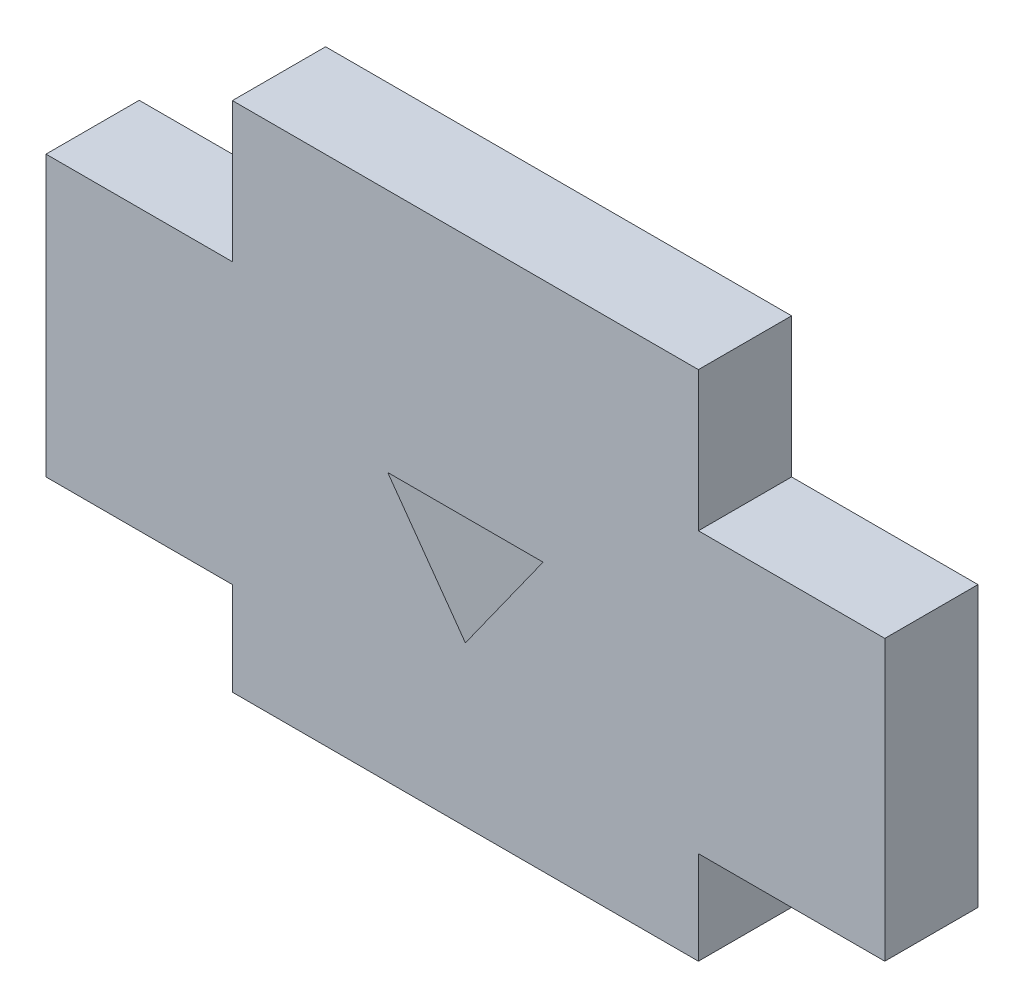
ISO-10303-21;
HEADER;
FILE_DESCRIPTION(('STEP AP214'),'2;1');
FILE_NAME('part.step','',(''),(''),'','','');
FILE_SCHEMA(('AUTOMOTIVE_DESIGN { 1 0 10303 214 1 1 1 1 }'));
ENDSEC;
DATA;
#1=APPLICATION_CONTEXT('core data for automotive mechanical design processes');
#2=APPLICATION_PROTOCOL_DEFINITION('international standard','automotive_design',2000,#1);
#3=PRODUCT_CONTEXT('',#1,'mechanical');
#4=PRODUCT('Part','Part','',(#3));
#5=PRODUCT_RELATED_PRODUCT_CATEGORY('part','',(#4));
#6=PRODUCT_DEFINITION_FORMATION('','',#4);
#7=PRODUCT_DEFINITION_CONTEXT('part definition',#1,'design');
#8=PRODUCT_DEFINITION('design','',#6,#7);
#9=PRODUCT_DEFINITION_SHAPE('','',#8);
#10=(LENGTH_UNIT() NAMED_UNIT(*) SI_UNIT(.MILLI.,.METRE.));
#11=(NAMED_UNIT(*) PLANE_ANGLE_UNIT() SI_UNIT($,.RADIAN.));
#12=(NAMED_UNIT(*) SI_UNIT($,.STERADIAN.) SOLID_ANGLE_UNIT());
#13=UNCERTAINTY_MEASURE_WITH_UNIT(LENGTH_MEASURE(1.E-05),#10,'distance_accuracy_value','');
#14=(GEOMETRIC_REPRESENTATION_CONTEXT(3) GLOBAL_UNCERTAINTY_ASSIGNED_CONTEXT((#13)) GLOBAL_UNIT_ASSIGNED_CONTEXT((#10,
#11,#12)) REPRESENTATION_CONTEXT('',''));
#15=CARTESIAN_POINT('',(0.,0.,0.));
#16=DIRECTION('',(0.,0.,1.));
#17=DIRECTION('',(1.,0.,0.));
#18=AXIS2_PLACEMENT_3D('',#15,#16,#17);
#19=CARTESIAN_POINT('',(0.,-35.3177567250291,6.));
#20=DIRECTION('',(0.,-1.,0.));
#21=DIRECTION('',(0.,0.,-1.));
#22=AXIS2_PLACEMENT_3D('',#19,#20,#21);
#23=PLANE('',#22);
#24=DIRECTION('',(-1.,0.,0.));
#25=VECTOR('',#24,1.);
#26=CARTESIAN_POINT('',(0.,-35.3177567250291,0.));
#27=LINE('',#26,#25);
#28=CARTESIAN_POINT('',(24.8661620551876,-35.3177567250291,0.));
#29=VERTEX_POINT('',#28);
#30=CARTESIAN_POINT('',(12.8661620551876,-35.3177567250291,0.));
#31=VERTEX_POINT('',#30);
#32=EDGE_CURVE('E203',#29,#31,#27,.T.);
#33=ORIENTED_EDGE('',*,*,#32,.T.);
#34=DIRECTION('',(0.,0.,-1.));
#35=VECTOR('',#34,1.);
#36=CARTESIAN_POINT('',(12.8661620551876,-35.3177567250291,6.));
#37=LINE('',#36,#35);
#38=CARTESIAN_POINT('',(12.8661620551876,-35.3177567250291,6.));
#39=VERTEX_POINT('',#38);
#40=EDGE_CURVE('E11',#39,#31,#37,.T.);
#41=ORIENTED_EDGE('',*,*,#40,.F.);
#42=DIRECTION('',(-1.,0.,0.));
#43=VECTOR('',#42,1.);
#44=CARTESIAN_POINT('',(0.,-35.3177567250291,6.));
#45=LINE('',#44,#43);
#46=CARTESIAN_POINT('',(24.8661620551876,-35.3177567250291,6.));
#47=VERTEX_POINT('',#46);
#48=EDGE_CURVE('E296',#47,#39,#45,.T.);
#49=ORIENTED_EDGE('',*,*,#48,.F.);
#50=DIRECTION('',(0.,0.,-1.));
#51=VECTOR('',#50,1.);
#52=CARTESIAN_POINT('',(24.8661620551876,-35.3177567250291,6.));
#53=LINE('',#52,#51);
#54=EDGE_CURVE('E61',#47,#29,#53,.T.);
#55=ORIENTED_EDGE('',*,*,#54,.T.);
#56=EDGE_LOOP('',(#33,#41,#49,#55));
#57=FACE_BOUND('',#56,.T.);
#58=ADVANCED_FACE('F41',(#57),#23,.F.);
#59=CARTESIAN_POINT('',(12.8661620551876,0.,6.));
#60=DIRECTION('',(-1.,0.,0.));
#61=DIRECTION('',(0.,0.,1.));
#62=AXIS2_PLACEMENT_3D('',#59,#60,#61);
#63=PLANE('',#62);
#64=DIRECTION('',(0.,1.,0.));
#65=VECTOR('',#64,1.);
#66=CARTESIAN_POINT('',(12.8661620551876,0.,0.));
#67=LINE('',#66,#65);
#68=CARTESIAN_POINT('',(12.8661620551876,-26.3328462460783,0.));
#69=VERTEX_POINT('',#68);
#70=EDGE_CURVE('E206',#31,#69,#67,.T.);
#71=ORIENTED_EDGE('',*,*,#70,.T.);
#72=DIRECTION('',(0.,0.,-1.));
#73=VECTOR('',#72,1.);
#74=CARTESIAN_POINT('',(12.8661620551876,-26.3328462460783,6.));
#75=LINE('',#74,#73);
#76=CARTESIAN_POINT('',(12.8661620551876,-26.3328462460783,6.));
#77=VERTEX_POINT('',#76);
#78=EDGE_CURVE('E52',#77,#69,#75,.T.);
#79=ORIENTED_EDGE('',*,*,#78,.F.);
#80=DIRECTION('',(0.,1.,0.));
#81=VECTOR('',#80,1.);
#82=CARTESIAN_POINT('',(12.8661620551876,0.,6.));
#83=LINE('',#82,#81);
#84=EDGE_CURVE('E300',#39,#77,#83,.T.);
#85=ORIENTED_EDGE('',*,*,#84,.F.);
#86=ORIENTED_EDGE('',*,*,#40,.T.);
#87=EDGE_LOOP('',(#71,#79,#85,#86));
#88=FACE_BOUND('',#87,.T.);
#89=ADVANCED_FACE('F352',(#88),#63,.F.);
#90=CARTESIAN_POINT('',(0.,-26.3328462460783,6.));
#91=DIRECTION('',(0.,1.,0.));
#92=DIRECTION('',(0.,0.,1.));
#93=AXIS2_PLACEMENT_3D('',#90,#91,#92);
#94=PLANE('',#93);
#95=DIRECTION('',(1.,0.,0.));
#96=VECTOR('',#95,1.);
#97=CARTESIAN_POINT('',(0.,-26.3328462460783,0.));
#98=LINE('',#97,#96);
#99=CARTESIAN_POINT('',(-17.1338379448124,-26.3328462460783,0.));
#100=VERTEX_POINT('',#99);
#101=EDGE_CURVE('E210',#100,#69,#98,.T.);
#102=ORIENTED_EDGE('',*,*,#101,.F.);
#103=DIRECTION('',(0.,0.,-1.));
#104=VECTOR('',#103,1.);
#105=CARTESIAN_POINT('',(-17.1338379448124,-26.3328462460783,6.));
#106=LINE('',#105,#104);
#107=CARTESIAN_POINT('',(-17.1338379448124,-26.3328462460783,6.));
#108=VERTEX_POINT('',#107);
#109=EDGE_CURVE('E268',#108,#100,#106,.T.);
#110=ORIENTED_EDGE('',*,*,#109,.F.);
#111=DIRECTION('',(1.,0.,0.));
#112=VECTOR('',#111,1.);
#113=CARTESIAN_POINT('',(0.,-26.3328462460783,6.));
#114=LINE('',#113,#112);
#115=EDGE_CURVE('E306',#108,#77,#114,.T.);
#116=ORIENTED_EDGE('',*,*,#115,.T.);
#117=ORIENTED_EDGE('',*,*,#78,.T.);
#118=EDGE_LOOP('',(#102,#110,#116,#117));
#119=FACE_BOUND('',#118,.T.);
#120=ADVANCED_FACE('F357',(#119),#94,.T.);
#121=CARTESIAN_POINT('',(-17.1338379448124,0.,6.));
#122=DIRECTION('',(-1.,0.,0.));
#123=DIRECTION('',(0.,-1.,0.));
#124=AXIS2_PLACEMENT_3D('',#121,#122,#123);
#125=PLANE('',#124);
#126=DIRECTION('',(0.,1.,0.));
#127=VECTOR('',#126,1.);
#128=CARTESIAN_POINT('',(-17.1338379448124,0.,0.));
#129=LINE('',#128,#127);
#130=CARTESIAN_POINT('',(-17.1338379448124,-35.3177567250291,0.));
#131=VERTEX_POINT('',#130);
#132=EDGE_CURVE('E214',#131,#100,#129,.T.);
#133=ORIENTED_EDGE('',*,*,#132,.F.);
#134=DIRECTION('',(0.,0.,-1.));
#135=VECTOR('',#134,1.);
#136=CARTESIAN_POINT('',(-17.1338379448124,-35.3177567250291,6.));
#137=LINE('',#136,#135);
#138=CARTESIAN_POINT('',(-17.1338379448124,-35.3177567250291,6.));
#139=VERTEX_POINT('',#138);
#140=EDGE_CURVE('E265',#139,#131,#137,.T.);
#141=ORIENTED_EDGE('',*,*,#140,.F.);
#142=DIRECTION('',(0.,1.,0.));
#143=VECTOR('',#142,1.);
#144=CARTESIAN_POINT('',(-17.1338379448124,0.,6.));
#145=LINE('',#144,#143);
#146=EDGE_CURVE('E310',#139,#108,#145,.T.);
#147=ORIENTED_EDGE('',*,*,#146,.T.);
#148=ORIENTED_EDGE('',*,*,#109,.T.);
#149=EDGE_LOOP('',(#133,#141,#147,#148));
#150=FACE_BOUND('',#149,.T.);
#151=ADVANCED_FACE('F452',(#150),#125,.T.);
#152=CARTESIAN_POINT('',(0.,-35.3177567250291,6.));
#153=DIRECTION('',(0.,1.,0.));
#154=DIRECTION('',(0.,0.,1.));
#155=AXIS2_PLACEMENT_3D('',#152,#153,#154);
#156=PLANE('',#155);
#157=DIRECTION('',(1.,0.,0.));
#158=VECTOR('',#157,1.);
#159=CARTESIAN_POINT('',(0.,-35.3177567250291,0.));
#160=LINE('',#159,#158);
#161=CARTESIAN_POINT('',(-29.1338379448124,-35.3177567250291,0.));
#162=VERTEX_POINT('',#161);
#163=EDGE_CURVE('E218',#162,#131,#160,.T.);
#164=ORIENTED_EDGE('',*,*,#163,.F.);
#165=DIRECTION('',(0.,0.,-1.));
#166=VECTOR('',#165,1.);
#167=CARTESIAN_POINT('',(-29.1338379448124,-35.3177567250291,6.));
#168=LINE('',#167,#166);
#169=CARTESIAN_POINT('',(-29.1338379448124,-35.3177567250291,6.));
#170=VERTEX_POINT('',#169);
#171=EDGE_CURVE('E262',#170,#162,#168,.T.);
#172=ORIENTED_EDGE('',*,*,#171,.F.);
#173=DIRECTION('',(1.,0.,0.));
#174=VECTOR('',#173,1.);
#175=CARTESIAN_POINT('',(0.,-35.3177567250291,6.));
#176=LINE('',#175,#174);
#177=EDGE_CURVE('E314',#170,#139,#176,.T.);
#178=ORIENTED_EDGE('',*,*,#177,.T.);
#179=ORIENTED_EDGE('',*,*,#140,.T.);
#180=EDGE_LOOP('',(#164,#172,#178,#179));
#181=FACE_BOUND('',#180,.T.);
#182=ADVANCED_FACE('F443',(#181),#156,.T.);
#183=CARTESIAN_POINT('',(-29.1338379448124,0.,6.));
#184=DIRECTION('',(1.,0.,0.));
#185=DIRECTION('',(0.,0.,-1.));
#186=AXIS2_PLACEMENT_3D('',#183,#184,#185);
#187=PLANE('',#186);
#188=DIRECTION('',(0.,-1.,0.));
#189=VECTOR('',#188,1.);
#190=CARTESIAN_POINT('',(-29.1338379448124,0.,0.));
#191=LINE('',#190,#189);
#192=CARTESIAN_POINT('',(-29.1338379448124,-53.3177567250291,0.));
#193=VERTEX_POINT('',#192);
#194=EDGE_CURVE('E222',#162,#193,#191,.T.);
#195=ORIENTED_EDGE('',*,*,#194,.T.);
#196=DIRECTION('',(0.,0.,-1.));
#197=VECTOR('',#196,1.);
#198=CARTESIAN_POINT('',(-29.1338379448124,-53.3177567250291,6.));
#199=LINE('',#198,#197);
#200=CARTESIAN_POINT('',(-29.1338379448124,-53.3177567250291,6.));
#201=VERTEX_POINT('',#200);
#202=EDGE_CURVE('E258',#201,#193,#199,.T.);
#203=ORIENTED_EDGE('',*,*,#202,.F.);
#204=DIRECTION('',(0.,-1.,0.));
#205=VECTOR('',#204,1.);
#206=CARTESIAN_POINT('',(-29.1338379448124,0.,6.));
#207=LINE('',#206,#205);
#208=EDGE_CURVE('E318',#170,#201,#207,.T.);
#209=ORIENTED_EDGE('',*,*,#208,.F.);
#210=ORIENTED_EDGE('',*,*,#171,.T.);
#211=EDGE_LOOP('',(#195,#203,#209,#210));
#212=FACE_BOUND('',#211,.T.);
#213=ADVANCED_FACE('F435',(#212),#187,.F.);
#214=CARTESIAN_POINT('',(0.,-53.3177567250291,6.));
#215=DIRECTION('',(0.,1.,0.));
#216=DIRECTION('',(0.,0.,1.));
#217=AXIS2_PLACEMENT_3D('',#214,#215,#216);
#218=PLANE('',#217);
#219=DIRECTION('',(1.,0.,0.));
#220=VECTOR('',#219,1.);
#221=CARTESIAN_POINT('',(0.,-53.3177567250291,0.));
#222=LINE('',#221,#220);
#223=CARTESIAN_POINT('',(-17.1338379448124,-53.3177567250291,0.));
#224=VERTEX_POINT('',#223);
#225=EDGE_CURVE('E225',#193,#224,#222,.T.);
#226=ORIENTED_EDGE('',*,*,#225,.T.);
#227=DIRECTION('',(0.,0.,-1.));
#228=VECTOR('',#227,1.);
#229=CARTESIAN_POINT('',(-17.1338379448124,-53.3177567250291,6.));
#230=LINE('',#229,#228);
#231=CARTESIAN_POINT('',(-17.1338379448124,-53.3177567250291,6.));
#232=VERTEX_POINT('',#231);
#233=EDGE_CURVE('E255',#232,#224,#230,.T.);
#234=ORIENTED_EDGE('',*,*,#233,.F.);
#235=DIRECTION('',(1.,0.,0.));
#236=VECTOR('',#235,1.);
#237=CARTESIAN_POINT('',(0.,-53.3177567250291,6.));
#238=LINE('',#237,#236);
#239=EDGE_CURVE('E321',#201,#232,#238,.T.);
#240=ORIENTED_EDGE('',*,*,#239,.F.);
#241=ORIENTED_EDGE('',*,*,#202,.T.);
#242=EDGE_LOOP('',(#226,#234,#240,#241));
#243=FACE_BOUND('',#242,.T.);
#244=ADVANCED_FACE('F337',(#243),#218,.F.);
#245=CARTESIAN_POINT('',(-17.1338379448124,0.,6.));
#246=DIRECTION('',(-1.,0.,0.));
#247=DIRECTION('',(0.,0.,1.));
#248=AXIS2_PLACEMENT_3D('',#245,#246,#247);
#249=PLANE('',#248);
#250=DIRECTION('',(0.,1.,0.));
#251=VECTOR('',#250,1.);
#252=CARTESIAN_POINT('',(-17.1338379448124,0.,0.));
#253=LINE('',#252,#251);
#254=CARTESIAN_POINT('',(-17.1338379448124,-59.3177567250291,0.));
#255=VERTEX_POINT('',#254);
#256=EDGE_CURVE('E229',#255,#224,#253,.T.);
#257=ORIENTED_EDGE('',*,*,#256,.F.);
#258=DIRECTION('',(0.,0.,-1.));
#259=VECTOR('',#258,1.);
#260=CARTESIAN_POINT('',(-17.1338379448124,-59.3177567250291,6.));
#261=LINE('',#260,#259);
#262=CARTESIAN_POINT('',(-17.1338379448124,-59.3177567250291,6.));
#263=VERTEX_POINT('',#262);
#264=EDGE_CURVE('E252',#263,#255,#261,.T.);
#265=ORIENTED_EDGE('',*,*,#264,.F.);
#266=DIRECTION('',(0.,1.,0.));
#267=VECTOR('',#266,1.);
#268=CARTESIAN_POINT('',(-17.1338379448124,0.,6.));
#269=LINE('',#268,#267);
#270=EDGE_CURVE('E324',#263,#232,#269,.T.);
#271=ORIENTED_EDGE('',*,*,#270,.T.);
#272=ORIENTED_EDGE('',*,*,#233,.T.);
#273=EDGE_LOOP('',(#257,#265,#271,#272));
#274=FACE_BOUND('',#273,.T.);
#275=ADVANCED_FACE('F330',(#274),#249,.T.);
#276=CARTESIAN_POINT('',(0.,-59.3177567250291,6.));
#277=DIRECTION('',(0.,1.,0.));
#278=DIRECTION('',(0.,0.,1.));
#279=AXIS2_PLACEMENT_3D('',#276,#277,#278);
#280=PLANE('',#279);
#281=DIRECTION('',(1.,0.,0.));
#282=VECTOR('',#281,1.);
#283=CARTESIAN_POINT('',(0.,-59.3177567250291,0.));
#284=LINE('',#283,#282);
#285=CARTESIAN_POINT('',(12.8661620551876,-59.3177567250291,0.));
#286=VERTEX_POINT('',#285);
#287=EDGE_CURVE('E233',#255,#286,#284,.T.);
#288=ORIENTED_EDGE('',*,*,#287,.T.);
#289=DIRECTION('',(0.,0.,-1.));
#290=VECTOR('',#289,1.);
#291=CARTESIAN_POINT('',(12.8661620551876,-59.3177567250291,6.));
#292=LINE('',#291,#290);
#293=CARTESIAN_POINT('',(12.8661620551876,-59.3177567250291,6.));
#294=VERTEX_POINT('',#293);
#295=EDGE_CURVE('E180',#294,#286,#292,.T.);
#296=ORIENTED_EDGE('',*,*,#295,.F.);
#297=DIRECTION('',(1.,0.,0.));
#298=VECTOR('',#297,1.);
#299=CARTESIAN_POINT('',(0.,-59.3177567250291,6.));
#300=LINE('',#299,#298);
#301=EDGE_CURVE('E166',#263,#294,#300,.T.);
#302=ORIENTED_EDGE('',*,*,#301,.F.);
#303=ORIENTED_EDGE('',*,*,#264,.T.);
#304=EDGE_LOOP('',(#288,#296,#302,#303));
#305=FACE_BOUND('',#304,.T.);
#306=ADVANCED_FACE('F342',(#305),#280,.F.);
#307=CARTESIAN_POINT('',(12.8661620551876,0.,6.));
#308=DIRECTION('',(-1.,0.,0.));
#309=DIRECTION('',(0.,0.,1.));
#310=AXIS2_PLACEMENT_3D('',#307,#308,#309);
#311=PLANE('',#310);
#312=DIRECTION('',(0.,1.,0.));
#313=VECTOR('',#312,1.);
#314=CARTESIAN_POINT('',(12.8661620551876,0.,0.));
#315=LINE('',#314,#313);
#316=CARTESIAN_POINT('',(12.8661620551876,-53.3177567250291,0.));
#317=VERTEX_POINT('',#316);
#318=EDGE_CURVE('E176',#286,#317,#315,.T.);
#319=ORIENTED_EDGE('',*,*,#318,.T.);
#320=DIRECTION('',(0.,0.,-1.));
#321=VECTOR('',#320,1.);
#322=CARTESIAN_POINT('',(12.8661620551876,-53.3177567250291,6.));
#323=LINE('',#322,#321);
#324=CARTESIAN_POINT('',(12.8661620551876,-53.3177567250291,6.));
#325=VERTEX_POINT('',#324);
#326=EDGE_CURVE('E173',#325,#317,#323,.T.);
#327=ORIENTED_EDGE('',*,*,#326,.F.);
#328=DIRECTION('',(0.,1.,0.));
#329=VECTOR('',#328,1.);
#330=CARTESIAN_POINT('',(12.8661620551876,0.,6.));
#331=LINE('',#330,#329);
#332=EDGE_CURVE('E157',#294,#325,#331,.T.);
#333=ORIENTED_EDGE('',*,*,#332,.F.);
#334=ORIENTED_EDGE('',*,*,#295,.T.);
#335=EDGE_LOOP('',(#319,#327,#333,#334));
#336=FACE_BOUND('',#335,.T.);
#337=ADVANCED_FACE('F174',(#336),#311,.F.);
#338=CARTESIAN_POINT('',(0.,-53.3177567250291,6.));
#339=DIRECTION('',(0.,-1.,0.));
#340=DIRECTION('',(0.,0.,-1.));
#341=AXIS2_PLACEMENT_3D('',#338,#339,#340);
#342=PLANE('',#341);
#343=DIRECTION('',(-1.,0.,0.));
#344=VECTOR('',#343,1.);
#345=CARTESIAN_POINT('',(0.,-53.3177567250291,0.));
#346=LINE('',#345,#344);
#347=CARTESIAN_POINT('',(24.8661620551876,-53.3177567250291,0.));
#348=VERTEX_POINT('',#347);
#349=EDGE_CURVE('E238',#348,#317,#346,.T.);
#350=ORIENTED_EDGE('',*,*,#349,.F.);
#351=DIRECTION('',(0.,0.,-1.));
#352=VECTOR('',#351,1.);
#353=CARTESIAN_POINT('',(24.8661620551876,-53.3177567250291,6.));
#354=LINE('',#353,#352);
#355=CARTESIAN_POINT('',(24.8661620551876,-53.3177567250291,6.));
#356=VERTEX_POINT('',#355);
#357=EDGE_CURVE('E108',#356,#348,#354,.T.);
#358=ORIENTED_EDGE('',*,*,#357,.F.);
#359=DIRECTION('',(-1.,0.,0.));
#360=VECTOR('',#359,1.);
#361=CARTESIAN_POINT('',(0.,-53.3177567250291,6.));
#362=LINE('',#361,#360);
#363=EDGE_CURVE('E163',#356,#325,#362,.T.);
#364=ORIENTED_EDGE('',*,*,#363,.T.);
#365=ORIENTED_EDGE('',*,*,#326,.T.);
#366=EDGE_LOOP('',(#350,#358,#364,#365));
#367=FACE_BOUND('',#366,.T.);
#368=ADVANCED_FACE('F182',(#367),#342,.T.);
#369=CARTESIAN_POINT('',(-24.6206695225922,-17.5861925161373,6.));
#370=DIRECTION('',(0.813733471206735,0.581238193719096,0.));
#371=DIRECTION('',(-0.581238193719096,0.813733471206735,0.));
#372=AXIS2_PLACEMENT_3D('',#369,#370,#371);
#373=PLANE('',#372);
#374=DIRECTION('',(0.581238193719096,-0.813733471206735,0.));
#375=VECTOR('',#374,1.);
#376=CARTESIAN_POINT('',(-24.6206695225922,-17.5861925161373,0.));
#377=LINE('',#376,#375);
#378=CARTESIAN_POINT('',(-7.13383794481242,-42.067756725029,0.));
#379=VERTEX_POINT('',#378);
#380=CARTESIAN_POINT('',(-2.13383794481243,-49.067756725029,0.));
#381=VERTEX_POINT('',#380);
#382=EDGE_CURVE('E191',#379,#381,#377,.T.);
#383=ORIENTED_EDGE('',*,*,#382,.F.);
#384=DIRECTION('',(0.,0.,-1.));
#385=VECTOR('',#384,1.);
#386=CARTESIAN_POINT('',(-7.13383794481242,-42.067756725029,6.));
#387=LINE('',#386,#385);
#388=CARTESIAN_POINT('',(-7.13383794481242,-42.067756725029,6.));
#389=VERTEX_POINT('',#388);
#390=EDGE_CURVE('E45',#389,#379,#387,.T.);
#391=ORIENTED_EDGE('',*,*,#390,.F.);
#392=DIRECTION('',(0.581238193719096,-0.813733471206735,0.));
#393=VECTOR('',#392,1.);
#394=CARTESIAN_POINT('',(-24.6206695225922,-17.5861925161373,6.));
#395=LINE('',#394,#393);
#396=CARTESIAN_POINT('',(-2.13383794481243,-49.067756725029,6.));
#397=VERTEX_POINT('',#396);
#398=EDGE_CURVE('E245',#389,#397,#395,.T.);
#399=ORIENTED_EDGE('',*,*,#398,.T.);
#400=DIRECTION('',(0.,0.,-1.));
#401=VECTOR('',#400,1.);
#402=CARTESIAN_POINT('',(-2.13383794481243,-49.067756725029,6.));
#403=LINE('',#402,#401);
#404=EDGE_CURVE('E187',#397,#381,#403,.T.);
#405=ORIENTED_EDGE('',*,*,#404,.T.);
#406=EDGE_LOOP('',(#383,#391,#399,#405));
#407=FACE_BOUND('',#406,.T.);
#408=ADVANCED_FACE('F43',(#407),#373,.T.);
#409=CARTESIAN_POINT('',(0.,-42.067756725029,6.));
#410=DIRECTION('',(0.,-1.,0.));
#411=DIRECTION('',(0.,0.,-1.));
#412=AXIS2_PLACEMENT_3D('',#409,#410,#411);
#413=PLANE('',#412);
#414=DIRECTION('',(-1.,0.,0.));
#415=VECTOR('',#414,1.);
#416=CARTESIAN_POINT('',(0.,-42.067756725029,0.));
#417=LINE('',#416,#415);
#418=CARTESIAN_POINT('',(2.86616205518758,-42.067756725029,0.));
#419=VERTEX_POINT('',#418);
#420=EDGE_CURVE('E195',#419,#379,#417,.T.);
#421=ORIENTED_EDGE('',*,*,#420,.F.);
#422=DIRECTION('',(0.,0.,-1.));
#423=VECTOR('',#422,1.);
#424=CARTESIAN_POINT('',(2.86616205518758,-42.067756725029,6.));
#425=LINE('',#424,#423);
#426=CARTESIAN_POINT('',(2.86616205518758,-42.067756725029,6.));
#427=VERTEX_POINT('',#426);
#428=EDGE_CURVE('E274',#427,#419,#425,.T.);
#429=ORIENTED_EDGE('',*,*,#428,.F.);
#430=DIRECTION('',(-1.,0.,0.));
#431=VECTOR('',#430,1.);
#432=CARTESIAN_POINT('',(0.,-42.067756725029,6.));
#433=LINE('',#432,#431);
#434=EDGE_CURVE('E285',#427,#389,#433,.T.);
#435=ORIENTED_EDGE('',*,*,#434,.T.);
#436=ORIENTED_EDGE('',*,*,#390,.T.);
#437=EDGE_LOOP('',(#421,#429,#435,#436));
#438=FACE_BOUND('',#437,.T.);
#439=ADVANCED_FACE('F283',(#438),#413,.T.);
#440=CARTESIAN_POINT('',(21.7947760281109,-15.5676971629364,6.));
#441=DIRECTION('',(-0.813733471206735,0.581238193719097,0.));
#442=DIRECTION('',(-0.581238193719097,-0.813733471206735,0.));
#443=AXIS2_PLACEMENT_3D('',#440,#441,#442);
#444=PLANE('',#443);
#445=DIRECTION('',(0.581238193719097,0.813733471206735,0.));
#446=VECTOR('',#445,1.);
#447=CARTESIAN_POINT('',(21.7947760281109,-15.5676971629364,0.));
#448=LINE('',#447,#446);
#449=EDGE_CURVE('E199',#381,#419,#448,.T.);
#450=ORIENTED_EDGE('',*,*,#449,.F.);
#451=ORIENTED_EDGE('',*,*,#404,.F.);
#452=DIRECTION('',(0.581238193719097,0.813733471206735,0.));
#453=VECTOR('',#452,1.);
#454=CARTESIAN_POINT('',(21.7947760281109,-15.5676971629364,6.));
#455=LINE('',#454,#453);
#456=EDGE_CURVE('E291',#397,#427,#455,.T.);
#457=ORIENTED_EDGE('',*,*,#456,.T.);
#458=ORIENTED_EDGE('',*,*,#428,.T.);
#459=EDGE_LOOP('',(#450,#451,#457,#458));
#460=FACE_BOUND('',#459,.T.);
#461=ADVANCED_FACE('F289',(#460),#444,.T.);
#462=CARTESIAN_POINT('',(24.8661620551876,0.,6.));
#463=DIRECTION('',(1.,0.,0.));
#464=DIRECTION('',(0.,1.,0.));
#465=AXIS2_PLACEMENT_3D('',#462,#463,#464);
#466=PLANE('',#465);
#467=DIRECTION('',(0.,-1.,0.));
#468=VECTOR('',#467,1.);
#469=CARTESIAN_POINT('',(24.8661620551876,0.,0.));
#470=LINE('',#469,#468);
#471=EDGE_CURVE('E241',#29,#348,#470,.T.);
#472=ORIENTED_EDGE('',*,*,#471,.F.);
#473=ORIENTED_EDGE('',*,*,#54,.F.);
#474=DIRECTION('',(0.,-1.,0.));
#475=VECTOR('',#474,1.);
#476=CARTESIAN_POINT('',(24.8661620551876,0.,6.));
#477=LINE('',#476,#475);
#478=EDGE_CURVE('E184',#47,#356,#477,.T.);
#479=ORIENTED_EDGE('',*,*,#478,.T.);
#480=ORIENTED_EDGE('',*,*,#357,.T.);
#481=EDGE_LOOP('',(#472,#473,#479,#480));
#482=FACE_BOUND('',#481,.T.);
#483=ADVANCED_FACE('F363',(#482),#466,.T.);
#484=CARTESIAN_POINT('',(0.,0.,6.));
#485=DIRECTION('',(0.,0.,1.));
#486=DIRECTION('',(1.,0.,0.));
#487=AXIS2_PLACEMENT_3D('',#484,#485,#486);
#488=PLANE('',#487);
#489=ORIENTED_EDGE('',*,*,#398,.F.);
#490=ORIENTED_EDGE('',*,*,#434,.F.);
#491=ORIENTED_EDGE('',*,*,#456,.F.);
#492=EDGE_LOOP('',(#489,#490,#491));
#493=FACE_BOUND('',#492,.T.);
#494=ORIENTED_EDGE('',*,*,#48,.T.);
#495=ORIENTED_EDGE('',*,*,#84,.T.);
#496=ORIENTED_EDGE('',*,*,#115,.F.);
#497=ORIENTED_EDGE('',*,*,#146,.F.);
#498=ORIENTED_EDGE('',*,*,#177,.F.);
#499=ORIENTED_EDGE('',*,*,#208,.T.);
#500=ORIENTED_EDGE('',*,*,#239,.T.);
#501=ORIENTED_EDGE('',*,*,#270,.F.);
#502=ORIENTED_EDGE('',*,*,#301,.T.);
#503=ORIENTED_EDGE('',*,*,#332,.T.);
#504=ORIENTED_EDGE('',*,*,#363,.F.);
#505=ORIENTED_EDGE('',*,*,#478,.F.);
#506=EDGE_LOOP('',(#494,#495,#496,#497,#498,#499,#500,#501,#502,#503,#504,#505));
#507=FACE_BOUND('',#506,.T.);
#508=ADVANCED_FACE('F160',(#493,#507),#488,.T.);
#509=CARTESIAN_POINT('',(0.,0.,0.));
#510=DIRECTION('',(0.,0.,1.));
#511=DIRECTION('',(1.,0.,0.));
#512=AXIS2_PLACEMENT_3D('',#509,#510,#511);
#513=PLANE('',#512);
#514=ORIENTED_EDGE('',*,*,#382,.T.);
#515=ORIENTED_EDGE('',*,*,#449,.T.);
#516=ORIENTED_EDGE('',*,*,#420,.T.);
#517=EDGE_LOOP('',(#514,#515,#516));
#518=FACE_BOUND('',#517,.T.);
#519=ORIENTED_EDGE('',*,*,#32,.F.);
#520=ORIENTED_EDGE('',*,*,#471,.T.);
#521=ORIENTED_EDGE('',*,*,#349,.T.);
#522=ORIENTED_EDGE('',*,*,#318,.F.);
#523=ORIENTED_EDGE('',*,*,#287,.F.);
#524=ORIENTED_EDGE('',*,*,#256,.T.);
#525=ORIENTED_EDGE('',*,*,#225,.F.);
#526=ORIENTED_EDGE('',*,*,#194,.F.);
#527=ORIENTED_EDGE('',*,*,#163,.T.);
#528=ORIENTED_EDGE('',*,*,#132,.T.);
#529=ORIENTED_EDGE('',*,*,#101,.T.);
#530=ORIENTED_EDGE('',*,*,#70,.F.);
#531=EDGE_LOOP('',(#519,#520,#521,#522,#523,#524,#525,#526,#527,#528,#529,#530));
#532=FACE_BOUND('',#531,.T.);
#533=ADVANCED_FACE('F287',(#518,#532),#513,.F.);
#534=CLOSED_SHELL('',(#58,#89,#120,#151,#182,#213,#244,#275,#306,#337,#368,#408,#439,#461,#483,
#508,#533));
#535=MANIFOLD_SOLID_BREP('B2',#534);
#536=ADVANCED_BREP_SHAPE_REPRESENTATION('',(#18,#535),#14);
#537=SHAPE_DEFINITION_REPRESENTATION(#9,#536);
ENDSEC;
END-ISO-10303-21;
